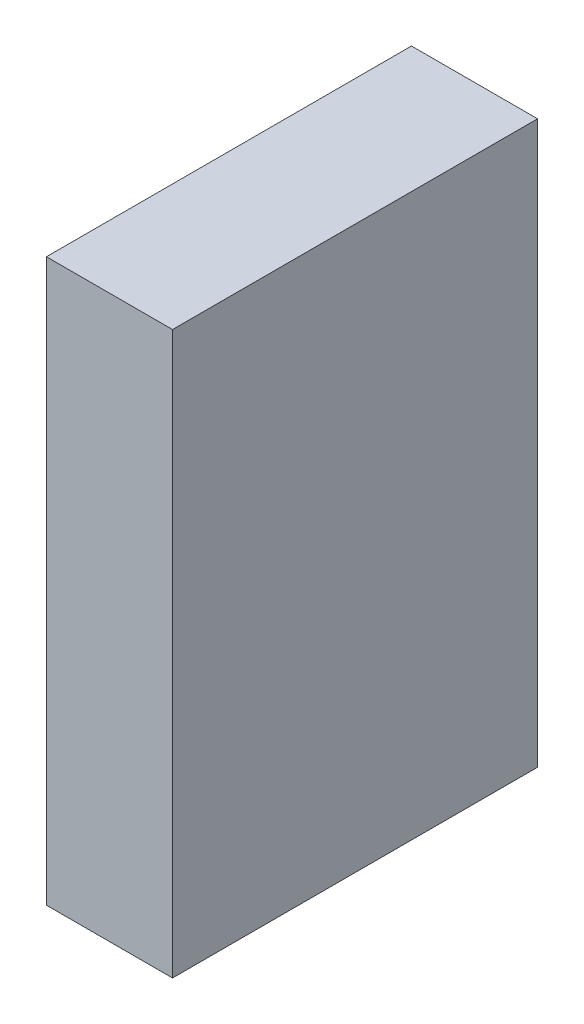
ISO-10303-21;
HEADER;
FILE_DESCRIPTION(('STEP AP214'),'2;1');
FILE_NAME('part.step','',(''),(''),'','','');
FILE_SCHEMA(('AUTOMOTIVE_DESIGN { 1 0 10303 214 1 1 1 1 }'));
ENDSEC;
DATA;
#1=APPLICATION_CONTEXT('core data for automotive mechanical design processes');
#2=APPLICATION_PROTOCOL_DEFINITION('international standard','automotive_design',2000,#1);
#3=PRODUCT_CONTEXT('',#1,'mechanical');
#4=PRODUCT('Part','Part','',(#3));
#5=PRODUCT_RELATED_PRODUCT_CATEGORY('part','',(#4));
#6=PRODUCT_DEFINITION_FORMATION('','',#4);
#7=PRODUCT_DEFINITION_CONTEXT('part definition',#1,'design');
#8=PRODUCT_DEFINITION('design','',#6,#7);
#9=PRODUCT_DEFINITION_SHAPE('','',#8);
#10=(LENGTH_UNIT() NAMED_UNIT(*) SI_UNIT(.MILLI.,.METRE.));
#11=(NAMED_UNIT(*) PLANE_ANGLE_UNIT() SI_UNIT($,.RADIAN.));
#12=(NAMED_UNIT(*) SI_UNIT($,.STERADIAN.) SOLID_ANGLE_UNIT());
#13=UNCERTAINTY_MEASURE_WITH_UNIT(LENGTH_MEASURE(1.E-05),#10,'distance_accuracy_value','');
#14=(GEOMETRIC_REPRESENTATION_CONTEXT(3) GLOBAL_UNCERTAINTY_ASSIGNED_CONTEXT((#13)) GLOBAL_UNIT_ASSIGNED_CONTEXT((#10,
#11,#12)) REPRESENTATION_CONTEXT('',''));
#15=CARTESIAN_POINT('',(0.,0.,0.));
#16=DIRECTION('',(0.,0.,1.));
#17=DIRECTION('',(1.,0.,0.));
#18=AXIS2_PLACEMENT_3D('',#15,#16,#17);
#19=CARTESIAN_POINT('',(1040.,8.88178419700125E-13,310.));
#20=DIRECTION('',(1.,0.,0.));
#21=DIRECTION('',(0.,0.,1.));
#22=AXIS2_PLACEMENT_3D('',#19,#20,#21);
#23=PLANE('',#22);
#24=DIRECTION('',(0.,0.,-1.));
#25=VECTOR('',#24,1.);
#26=CARTESIAN_POINT('',(1040.,2000.,310.));
#27=LINE('',#26,#25);
#28=CARTESIAN_POINT('',(1040.,2000.,310.));
#29=VERTEX_POINT('',#28);
#30=CARTESIAN_POINT('',(1040.,2000.,-990.));
#31=VERTEX_POINT('',#30);
#32=EDGE_CURVE('E61',#29,#31,#27,.T.);
#33=ORIENTED_EDGE('',*,*,#32,.T.);
#34=DIRECTION('',(0.,1.,0.));
#35=VECTOR('',#34,1.);
#36=CARTESIAN_POINT('',(1040.,6.66133814775094E-13,-990.));
#37=LINE('',#36,#35);
#38=CARTESIAN_POINT('',(1040.,6.66133814775094E-13,-990.));
#39=VERTEX_POINT('',#38);
#40=EDGE_CURVE('E11',#39,#31,#37,.T.);
#41=ORIENTED_EDGE('',*,*,#40,.F.);
#42=DIRECTION('',(0.,0.,-1.));
#43=VECTOR('',#42,1.);
#44=CARTESIAN_POINT('',(1040.,8.88178419700125E-13,310.));
#45=LINE('',#44,#43);
#46=CARTESIAN_POINT('',(1040.,8.88178419700125E-13,310.));
#47=VERTEX_POINT('',#46);
#48=EDGE_CURVE('E80',#47,#39,#45,.T.);
#49=ORIENTED_EDGE('',*,*,#48,.F.);
#50=DIRECTION('',(0.,1.,0.));
#51=VECTOR('',#50,1.);
#52=CARTESIAN_POINT('',(1040.,8.88178419700125E-13,310.));
#53=LINE('',#52,#51);
#54=EDGE_CURVE('E73',#47,#29,#53,.T.);
#55=ORIENTED_EDGE('',*,*,#54,.T.);
#56=EDGE_LOOP('',(#33,#41,#49,#55));
#57=FACE_BOUND('',#56,.T.);
#58=ADVANCED_FACE('F17',(#57),#23,.F.);
#59=CARTESIAN_POINT('',(1040.,6.66133814775094E-13,-990.));
#60=DIRECTION('',(0.,0.,1.));
#61=DIRECTION('',(-1.,0.,0.));
#62=AXIS2_PLACEMENT_3D('',#59,#60,#61);
#63=PLANE('',#62);
#64=DIRECTION('',(1.,0.,0.));
#65=VECTOR('',#64,1.);
#66=CARTESIAN_POINT('',(1040.,2000.,-990.));
#67=LINE('',#66,#65);
#68=CARTESIAN_POINT('',(1489.,2000.,-990.));
#69=VERTEX_POINT('',#68);
#70=EDGE_CURVE('E57',#31,#69,#67,.T.);
#71=ORIENTED_EDGE('',*,*,#70,.T.);
#72=DIRECTION('',(0.,1.,0.));
#73=VECTOR('',#72,1.);
#74=CARTESIAN_POINT('',(1489.,6.66133814775094E-13,-990.));
#75=LINE('',#74,#73);
#76=CARTESIAN_POINT('',(1489.,6.66133814775094E-13,-990.));
#77=VERTEX_POINT('',#76);
#78=EDGE_CURVE('E24',#77,#69,#75,.T.);
#79=ORIENTED_EDGE('',*,*,#78,.F.);
#80=DIRECTION('',(1.,0.,0.));
#81=VECTOR('',#80,1.);
#82=CARTESIAN_POINT('',(1040.,6.66133814775094E-13,-990.));
#83=LINE('',#82,#81);
#84=EDGE_CURVE('E69',#39,#77,#83,.T.);
#85=ORIENTED_EDGE('',*,*,#84,.F.);
#86=ORIENTED_EDGE('',*,*,#40,.T.);
#87=EDGE_LOOP('',(#71,#79,#85,#86));
#88=FACE_BOUND('',#87,.T.);
#89=ADVANCED_FACE('F68',(#88),#63,.F.);
#90=CARTESIAN_POINT('',(1489.,6.66133814775094E-13,-990.));
#91=DIRECTION('',(-1.,0.,0.));
#92=DIRECTION('',(0.,0.,-1.));
#93=AXIS2_PLACEMENT_3D('',#90,#91,#92);
#94=PLANE('',#93);
#95=DIRECTION('',(0.,0.,1.));
#96=VECTOR('',#95,1.);
#97=CARTESIAN_POINT('',(1489.,2000.,-990.));
#98=LINE('',#97,#96);
#99=CARTESIAN_POINT('',(1489.,2000.,310.));
#100=VERTEX_POINT('',#99);
#101=EDGE_CURVE('E62',#69,#100,#98,.T.);
#102=ORIENTED_EDGE('',*,*,#101,.T.);
#103=DIRECTION('',(0.,1.,0.));
#104=VECTOR('',#103,1.);
#105=CARTESIAN_POINT('',(1489.,8.88178419700125E-13,310.));
#106=LINE('',#105,#104);
#107=CARTESIAN_POINT('',(1489.,8.88178419700125E-13,310.));
#108=VERTEX_POINT('',#107);
#109=EDGE_CURVE('E85',#108,#100,#106,.T.);
#110=ORIENTED_EDGE('',*,*,#109,.F.);
#111=DIRECTION('',(0.,0.,1.));
#112=VECTOR('',#111,1.);
#113=CARTESIAN_POINT('',(1489.,6.66133814775094E-13,-990.));
#114=LINE('',#113,#112);
#115=EDGE_CURVE('E36',#77,#108,#114,.T.);
#116=ORIENTED_EDGE('',*,*,#115,.F.);
#117=ORIENTED_EDGE('',*,*,#78,.T.);
#118=EDGE_LOOP('',(#102,#110,#116,#117));
#119=FACE_BOUND('',#118,.T.);
#120=ADVANCED_FACE('F88',(#119),#94,.F.);
#121=CARTESIAN_POINT('',(1489.,8.88178419700125E-13,310.));
#122=DIRECTION('',(0.,0.,-1.));
#123=DIRECTION('',(1.,0.,0.));
#124=AXIS2_PLACEMENT_3D('',#121,#122,#123);
#125=PLANE('',#124);
#126=DIRECTION('',(-1.,0.,0.));
#127=VECTOR('',#126,1.);
#128=CARTESIAN_POINT('',(1489.,2000.,310.));
#129=LINE('',#128,#127);
#130=EDGE_CURVE('E77',#100,#29,#129,.T.);
#131=ORIENTED_EDGE('',*,*,#130,.T.);
#132=ORIENTED_EDGE('',*,*,#54,.F.);
#133=DIRECTION('',(-1.,0.,0.));
#134=VECTOR('',#133,1.);
#135=CARTESIAN_POINT('',(1489.,8.88178419700125E-13,310.));
#136=LINE('',#135,#134);
#137=EDGE_CURVE('E31',#108,#47,#136,.T.);
#138=ORIENTED_EDGE('',*,*,#137,.F.);
#139=ORIENTED_EDGE('',*,*,#109,.T.);
#140=EDGE_LOOP('',(#131,#132,#138,#139));
#141=FACE_BOUND('',#140,.T.);
#142=ADVANCED_FACE('F90',(#141),#125,.F.);
#143=CARTESIAN_POINT('',(1040.,6.66133814775094E-13,-990.));
#144=DIRECTION('',(0.,-1.,0.));
#145=DIRECTION('',(0.,0.,-1.));
#146=AXIS2_PLACEMENT_3D('',#143,#144,#145);
#147=PLANE('',#146);
#148=ORIENTED_EDGE('',*,*,#48,.T.);
#149=ORIENTED_EDGE('',*,*,#84,.T.);
#150=ORIENTED_EDGE('',*,*,#115,.T.);
#151=ORIENTED_EDGE('',*,*,#137,.T.);
#152=EDGE_LOOP('',(#148,#149,#150,#151));
#153=FACE_BOUND('',#152,.T.);
#154=ADVANCED_FACE('F91',(#153),#147,.T.);
#155=CARTESIAN_POINT('',(1040.,2000.,-990.));
#156=DIRECTION('',(0.,-1.,0.));
#157=DIRECTION('',(0.,0.,-1.));
#158=AXIS2_PLACEMENT_3D('',#155,#156,#157);
#159=PLANE('',#158);
#160=ORIENTED_EDGE('',*,*,#32,.F.);
#161=ORIENTED_EDGE('',*,*,#130,.F.);
#162=ORIENTED_EDGE('',*,*,#101,.F.);
#163=ORIENTED_EDGE('',*,*,#70,.F.);
#164=EDGE_LOOP('',(#160,#161,#162,#163));
#165=FACE_BOUND('',#164,.T.);
#166=ADVANCED_FACE('F58',(#165),#159,.F.);
#167=CLOSED_SHELL('',(#58,#89,#120,#142,#154,#166));
#168=MANIFOLD_SOLID_BREP('B1',#167);
#169=ADVANCED_BREP_SHAPE_REPRESENTATION('',(#18,#168),#14);
#170=SHAPE_DEFINITION_REPRESENTATION(#9,#169);
ENDSEC;
END-ISO-10303-21;
